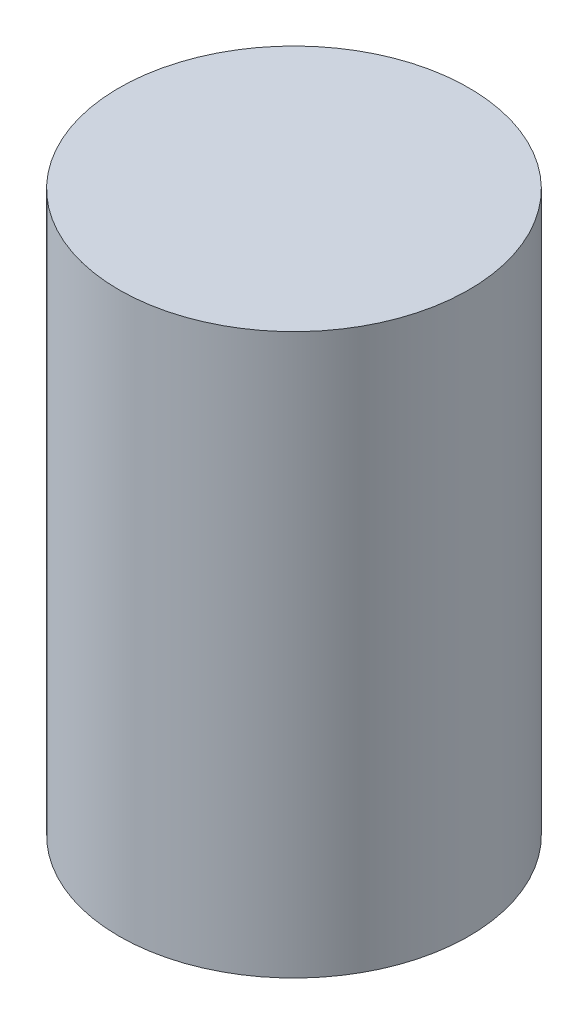
ISO-10303-21;
HEADER;
FILE_DESCRIPTION(('STEP AP214'),'2;1');
FILE_NAME('part.step','',(''),(''),'','','');
FILE_SCHEMA(('AUTOMOTIVE_DESIGN { 1 0 10303 214 1 1 1 1 }'));
ENDSEC;
DATA;
#1=APPLICATION_CONTEXT('core data for automotive mechanical design processes');
#2=APPLICATION_PROTOCOL_DEFINITION('international standard','automotive_design',2000,#1);
#3=PRODUCT_CONTEXT('',#1,'mechanical');
#4=PRODUCT('Part','Part','',(#3));
#5=PRODUCT_RELATED_PRODUCT_CATEGORY('part','',(#4));
#6=PRODUCT_DEFINITION_FORMATION('','',#4);
#7=PRODUCT_DEFINITION_CONTEXT('part definition',#1,'design');
#8=PRODUCT_DEFINITION('design','',#6,#7);
#9=PRODUCT_DEFINITION_SHAPE('','',#8);
#10=(LENGTH_UNIT() NAMED_UNIT(*) SI_UNIT(.MILLI.,.METRE.));
#11=(NAMED_UNIT(*) PLANE_ANGLE_UNIT() SI_UNIT($,.RADIAN.));
#12=(NAMED_UNIT(*) SI_UNIT($,.STERADIAN.) SOLID_ANGLE_UNIT());
#13=UNCERTAINTY_MEASURE_WITH_UNIT(LENGTH_MEASURE(1.E-05),#10,'distance_accuracy_value','');
#14=(GEOMETRIC_REPRESENTATION_CONTEXT(3) GLOBAL_UNCERTAINTY_ASSIGNED_CONTEXT((#13)) GLOBAL_UNIT_ASSIGNED_CONTEXT((#10,
#11,#12)) REPRESENTATION_CONTEXT('',''));
#15=CARTESIAN_POINT('',(0.,0.,0.));
#16=DIRECTION('',(0.,0.,1.));
#17=DIRECTION('',(1.,0.,0.));
#18=AXIS2_PLACEMENT_3D('',#15,#16,#17);
#19=CARTESIAN_POINT('',(0.,8.,0.));
#20=DIRECTION('',(0.,-1.,0.));
#21=DIRECTION('',(0.,0.,-1.));
#22=AXIS2_PLACEMENT_3D('',#19,#20,#21);
#23=CYLINDRICAL_SURFACE('',#22,2.5);
#24=CARTESIAN_POINT('',(0.,8.,0.));
#25=DIRECTION('',(0.,1.,0.));
#26=DIRECTION('',(0.,0.,1.));
#27=AXIS2_PLACEMENT_3D('',#24,#25,#26);
#28=CIRCLE('',#27,2.5);
#29=CARTESIAN_POINT('',(0.,8.,2.5));
#30=VERTEX_POINT('',#29);
#31=EDGE_CURVE('E10',#30,#30,#28,.T.);
#32=ORIENTED_EDGE('',*,*,#31,.F.);
#33=EDGE_LOOP('',(#32));
#34=FACE_BOUND('',#33,.T.);
#35=CARTESIAN_POINT('',(0.,0.,0.));
#36=DIRECTION('',(0.,1.,0.));
#37=DIRECTION('',(0.,0.,1.));
#38=AXIS2_PLACEMENT_3D('',#35,#36,#37);
#39=CIRCLE('',#38,2.5);
#40=CARTESIAN_POINT('',(0.,0.,2.5));
#41=VERTEX_POINT('',#40);
#42=EDGE_CURVE('E37',#41,#41,#39,.T.);
#43=ORIENTED_EDGE('',*,*,#42,.T.);
#44=EDGE_LOOP('',(#43));
#45=FACE_BOUND('',#44,.T.);
#46=ADVANCED_FACE('F34',(#34,#45),#23,.T.);
#47=CARTESIAN_POINT('',(0.,8.,0.));
#48=DIRECTION('',(0.,1.,0.));
#49=DIRECTION('',(0.,0.,1.));
#50=AXIS2_PLACEMENT_3D('',#47,#48,#49);
#51=PLANE('',#50);
#52=ORIENTED_EDGE('',*,*,#31,.T.);
#53=EDGE_LOOP('',(#52));
#54=FACE_BOUND('',#53,.T.);
#55=ADVANCED_FACE('F49',(#54),#51,.T.);
#56=CARTESIAN_POINT('',(0.,0.,0.));
#57=DIRECTION('',(0.,1.,0.));
#58=DIRECTION('',(0.,0.,1.));
#59=AXIS2_PLACEMENT_3D('',#56,#57,#58);
#60=PLANE('',#59);
#61=ORIENTED_EDGE('',*,*,#42,.F.);
#62=EDGE_LOOP('',(#61));
#63=FACE_BOUND('',#62,.T.);
#64=ADVANCED_FACE('F47',(#63),#60,.F.);
#65=CLOSED_SHELL('',(#46,#55,#64));
#66=MANIFOLD_SOLID_BREP('B2',#65);
#67=ADVANCED_BREP_SHAPE_REPRESENTATION('',(#18,#66),#14);
#68=SHAPE_DEFINITION_REPRESENTATION(#9,#67);
ENDSEC;
END-ISO-10303-21;
